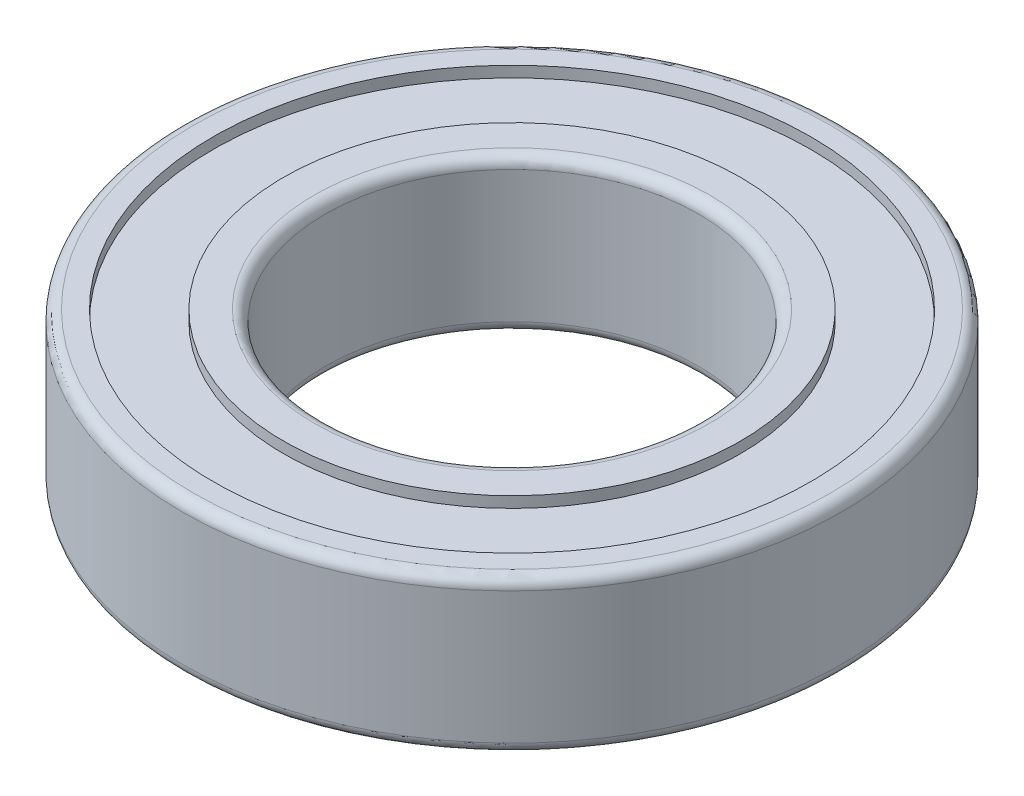
ISO-10303-21;
HEADER;
FILE_DESCRIPTION(('STEP AP214'),'2;1');
FILE_NAME('part.step','',(''),(''),'','','');
FILE_SCHEMA(('AUTOMOTIVE_DESIGN { 1 0 10303 214 1 1 1 1 }'));
ENDSEC;
DATA;
#1=APPLICATION_CONTEXT('core data for automotive mechanical design processes');
#2=APPLICATION_PROTOCOL_DEFINITION('international standard','automotive_design',2000,#1);
#3=PRODUCT_CONTEXT('',#1,'mechanical');
#4=PRODUCT('Part','Part','',(#3));
#5=PRODUCT_RELATED_PRODUCT_CATEGORY('part','',(#4));
#6=PRODUCT_DEFINITION_FORMATION('','',#4);
#7=PRODUCT_DEFINITION_CONTEXT('part definition',#1,'design');
#8=PRODUCT_DEFINITION('design','',#6,#7);
#9=PRODUCT_DEFINITION_SHAPE('','',#8);
#10=(LENGTH_UNIT() NAMED_UNIT(*) SI_UNIT(.MILLI.,.METRE.));
#11=(NAMED_UNIT(*) PLANE_ANGLE_UNIT() SI_UNIT($,.RADIAN.));
#12=(NAMED_UNIT(*) SI_UNIT($,.STERADIAN.) SOLID_ANGLE_UNIT());
#13=UNCERTAINTY_MEASURE_WITH_UNIT(LENGTH_MEASURE(1.E-05),#10,'distance_accuracy_value','');
#14=(GEOMETRIC_REPRESENTATION_CONTEXT(3) GLOBAL_UNCERTAINTY_ASSIGNED_CONTEXT((#13)) GLOBAL_UNIT_ASSIGNED_CONTEXT((#10,
#11,#12)) REPRESENTATION_CONTEXT('',''));
#15=CARTESIAN_POINT('',(0.,0.,0.));
#16=DIRECTION('',(0.,0.,1.));
#17=DIRECTION('',(1.,0.,0.));
#18=AXIS2_PLACEMENT_3D('',#15,#16,#17);
#19=CARTESIAN_POINT('',(0.,0.,0.));
#20=DIRECTION('',(0.,-1.,0.));
#21=DIRECTION('',(0.,0.,-1.));
#22=AXIS2_PLACEMENT_3D('',#19,#20,#21);
#23=CYLINDRICAL_SURFACE('',#22,8.5);
#24=CARTESIAN_POINT('',(0.,0.5,0.));
#25=DIRECTION('',(0.,-1.,0.));
#26=DIRECTION('',(0.,0.,-1.));
#27=AXIS2_PLACEMENT_3D('',#24,#25,#26);
#28=CIRCLE('',#27,8.5);
#29=CARTESIAN_POINT('',(0.,0.5,-8.5));
#30=VERTEX_POINT('',#29);
#31=EDGE_CURVE('E53',#30,#30,#28,.T.);
#32=ORIENTED_EDGE('',*,*,#31,.T.);
#33=EDGE_LOOP('',(#32));
#34=FACE_BOUND('',#33,.T.);
#35=CARTESIAN_POINT('',(0.,6.5,0.));
#36=DIRECTION('',(0.,1.,0.));
#37=DIRECTION('',(0.,0.,1.));
#38=AXIS2_PLACEMENT_3D('',#35,#36,#37);
#39=CIRCLE('',#38,8.5);
#40=CARTESIAN_POINT('',(0.,6.5,8.5));
#41=VERTEX_POINT('',#40);
#42=EDGE_CURVE('E56',#41,#41,#39,.T.);
#43=ORIENTED_EDGE('',*,*,#42,.T.);
#44=EDGE_LOOP('',(#43));
#45=FACE_BOUND('',#44,.T.);
#46=ADVANCED_FACE('F39',(#34,#45),#23,.F.);
#47=CARTESIAN_POINT('',(8.5,0.,0.));
#48=DIRECTION('',(0.,-1.,0.));
#49=DIRECTION('',(0.,0.,-1.));
#50=AXIS2_PLACEMENT_3D('',#47,#48,#49);
#51=PLANE('',#50);
#52=CARTESIAN_POINT('',(0.,0.,0.));
#53=DIRECTION('',(0.,-1.,0.));
#54=DIRECTION('',(0.,0.,-1.));
#55=AXIS2_PLACEMENT_3D('',#52,#53,#54);
#56=CIRCLE('',#55,9.);
#57=CARTESIAN_POINT('',(0.,0.,-9.));
#58=VERTEX_POINT('',#57);
#59=EDGE_CURVE('E49',#58,#58,#56,.F.);
#60=ORIENTED_EDGE('',*,*,#59,.T.);
#61=EDGE_LOOP('',(#60));
#62=FACE_BOUND('',#61,.T.);
#63=CARTESIAN_POINT('',(0.,0.,0.));
#64=DIRECTION('',(0.,-1.,0.));
#65=DIRECTION('',(0.,0.,-1.));
#66=AXIS2_PLACEMENT_3D('',#63,#64,#65);
#67=CIRCLE('',#66,10.4);
#68=CARTESIAN_POINT('',(0.,0.,-10.4));
#69=VERTEX_POINT('',#68);
#70=EDGE_CURVE('E72',#69,#69,#67,.T.);
#71=ORIENTED_EDGE('',*,*,#70,.T.);
#72=EDGE_LOOP('',(#71));
#73=FACE_BOUND('',#72,.T.);
#74=ADVANCED_FACE('F111',(#62,#73),#51,.T.);
#75=CARTESIAN_POINT('',(0.,0.,0.));
#76=DIRECTION('',(0.,-1.,0.));
#77=DIRECTION('',(0.,0.,-1.));
#78=AXIS2_PLACEMENT_3D('',#75,#76,#77);
#79=CYLINDRICAL_SURFACE('',#78,10.4);
#80=CARTESIAN_POINT('',(0.,0.5,0.));
#81=DIRECTION('',(0.,-1.,0.));
#82=DIRECTION('',(0.,0.,-1.));
#83=AXIS2_PLACEMENT_3D('',#80,#81,#82);
#84=CIRCLE('',#83,10.4);
#85=CARTESIAN_POINT('',(0.,0.5,-10.4));
#86=VERTEX_POINT('',#85);
#87=EDGE_CURVE('E74',#86,#86,#84,.T.);
#88=ORIENTED_EDGE('',*,*,#87,.T.);
#89=EDGE_LOOP('',(#88));
#90=FACE_BOUND('',#89,.T.);
#91=ORIENTED_EDGE('',*,*,#70,.F.);
#92=EDGE_LOOP('',(#91));
#93=FACE_BOUND('',#92,.T.);
#94=ADVANCED_FACE('F117',(#90,#93),#79,.T.);
#95=CARTESIAN_POINT('',(10.4,0.5,0.));
#96=DIRECTION('',(0.,-1.,0.));
#97=DIRECTION('',(0.,0.,-1.));
#98=AXIS2_PLACEMENT_3D('',#95,#96,#97);
#99=PLANE('',#98);
#100=CARTESIAN_POINT('',(0.,0.5,0.));
#101=DIRECTION('',(0.,-1.,0.));
#102=DIRECTION('',(0.,0.,-1.));
#103=AXIS2_PLACEMENT_3D('',#100,#101,#102);
#104=CIRCLE('',#103,13.6);
#105=CARTESIAN_POINT('',(0.,0.5,-13.6));
#106=VERTEX_POINT('',#105);
#107=EDGE_CURVE('E80',#106,#106,#104,.T.);
#108=ORIENTED_EDGE('',*,*,#107,.T.);
#109=EDGE_LOOP('',(#108));
#110=FACE_BOUND('',#109,.T.);
#111=ORIENTED_EDGE('',*,*,#87,.F.);
#112=EDGE_LOOP('',(#111));
#113=FACE_BOUND('',#112,.T.);
#114=ADVANCED_FACE('F156',(#110,#113),#99,.T.);
#115=CARTESIAN_POINT('',(0.,0.,0.));
#116=DIRECTION('',(0.,-1.,0.));
#117=DIRECTION('',(0.,0.,-1.));
#118=AXIS2_PLACEMENT_3D('',#115,#116,#117);
#119=CYLINDRICAL_SURFACE('',#118,13.6);
#120=CARTESIAN_POINT('',(0.,0.,0.));
#121=DIRECTION('',(0.,-1.,0.));
#122=DIRECTION('',(0.,0.,-1.));
#123=AXIS2_PLACEMENT_3D('',#120,#121,#122);
#124=CIRCLE('',#123,13.6);
#125=CARTESIAN_POINT('',(0.,0.,-13.6));
#126=VERTEX_POINT('',#125);
#127=EDGE_CURVE('E77',#126,#126,#124,.T.);
#128=ORIENTED_EDGE('',*,*,#127,.T.);
#129=EDGE_LOOP('',(#128));
#130=FACE_BOUND('',#129,.T.);
#131=ORIENTED_EDGE('',*,*,#107,.F.);
#132=EDGE_LOOP('',(#131));
#133=FACE_BOUND('',#132,.T.);
#134=ADVANCED_FACE('F149',(#130,#133),#119,.F.);
#135=CARTESIAN_POINT('',(13.6,0.,0.));
#136=DIRECTION('',(0.,-1.,0.));
#137=DIRECTION('',(0.,0.,-1.));
#138=AXIS2_PLACEMENT_3D('',#135,#136,#137);
#139=PLANE('',#138);
#140=CARTESIAN_POINT('',(0.,0.,0.));
#141=DIRECTION('',(0.,-1.,0.));
#142=DIRECTION('',(0.,0.,-1.));
#143=AXIS2_PLACEMENT_3D('',#140,#141,#142);
#144=CIRCLE('',#143,14.5);
#145=CARTESIAN_POINT('',(0.,0.,-14.5));
#146=VERTEX_POINT('',#145);
#147=EDGE_CURVE('E67',#146,#146,#144,.T.);
#148=ORIENTED_EDGE('',*,*,#147,.T.);
#149=EDGE_LOOP('',(#148));
#150=FACE_BOUND('',#149,.T.);
#151=ORIENTED_EDGE('',*,*,#127,.F.);
#152=EDGE_LOOP('',(#151));
#153=FACE_BOUND('',#152,.T.);
#154=ADVANCED_FACE('F143',(#150,#153),#139,.T.);
#155=CARTESIAN_POINT('',(0.,0.,0.));
#156=DIRECTION('',(0.,-1.,0.));
#157=DIRECTION('',(0.,0.,-1.));
#158=AXIS2_PLACEMENT_3D('',#155,#156,#157);
#159=CYLINDRICAL_SURFACE('',#158,15.);
#160=CARTESIAN_POINT('',(0.,0.5,0.));
#161=DIRECTION('',(0.,-1.,0.));
#162=DIRECTION('',(0.,0.,-1.));
#163=AXIS2_PLACEMENT_3D('',#160,#161,#162);
#164=CIRCLE('',#163,15.);
#165=CARTESIAN_POINT('',(0.,0.5,-15.));
#166=VERTEX_POINT('',#165);
#167=EDGE_CURVE('E65',#166,#166,#164,.F.);
#168=ORIENTED_EDGE('',*,*,#167,.T.);
#169=EDGE_LOOP('',(#168));
#170=FACE_BOUND('',#169,.T.);
#171=CARTESIAN_POINT('',(0.,6.5,0.));
#172=DIRECTION('',(0.,1.,0.));
#173=DIRECTION('',(0.,0.,1.));
#174=AXIS2_PLACEMENT_3D('',#171,#172,#173);
#175=CIRCLE('',#174,15.);
#176=CARTESIAN_POINT('',(0.,6.5,15.));
#177=VERTEX_POINT('',#176);
#178=EDGE_CURVE('E62',#177,#177,#175,.F.);
#179=ORIENTED_EDGE('',*,*,#178,.T.);
#180=EDGE_LOOP('',(#179));
#181=FACE_BOUND('',#180,.T.);
#182=ADVANCED_FACE('F137',(#170,#181),#159,.T.);
#183=CARTESIAN_POINT('',(15.,7.,0.));
#184=DIRECTION('',(0.,1.,0.));
#185=DIRECTION('',(0.,0.,1.));
#186=AXIS2_PLACEMENT_3D('',#183,#184,#185);
#187=PLANE('',#186);
#188=CARTESIAN_POINT('',(0.,7.,0.));
#189=DIRECTION('',(0.,1.,0.));
#190=DIRECTION('',(0.,0.,1.));
#191=AXIS2_PLACEMENT_3D('',#188,#189,#190);
#192=CIRCLE('',#191,14.5);
#193=CARTESIAN_POINT('',(0.,7.,14.5));
#194=VERTEX_POINT('',#193);
#195=EDGE_CURVE('E46',#194,#194,#192,.T.);
#196=ORIENTED_EDGE('',*,*,#195,.T.);
#197=EDGE_LOOP('',(#196));
#198=FACE_BOUND('',#197,.T.);
#199=CARTESIAN_POINT('',(0.,7.,0.));
#200=DIRECTION('',(0.,-1.,0.));
#201=DIRECTION('',(0.,0.,-1.));
#202=AXIS2_PLACEMENT_3D('',#199,#200,#201);
#203=CIRCLE('',#202,13.6);
#204=CARTESIAN_POINT('',(0.,7.,-13.6));
#205=VERTEX_POINT('',#204);
#206=EDGE_CURVE('E82',#205,#205,#203,.T.);
#207=ORIENTED_EDGE('',*,*,#206,.T.);
#208=EDGE_LOOP('',(#207));
#209=FACE_BOUND('',#208,.T.);
#210=ADVANCED_FACE('F139',(#198,#209),#187,.T.);
#211=CARTESIAN_POINT('',(0.,0.,0.));
#212=DIRECTION('',(0.,-1.,0.));
#213=DIRECTION('',(0.,0.,-1.));
#214=AXIS2_PLACEMENT_3D('',#211,#212,#213);
#215=CYLINDRICAL_SURFACE('',#214,13.6);
#216=CARTESIAN_POINT('',(0.,6.5,0.));
#217=DIRECTION('',(0.,-1.,0.));
#218=DIRECTION('',(0.,0.,-1.));
#219=AXIS2_PLACEMENT_3D('',#216,#217,#218);
#220=CIRCLE('',#219,13.6);
#221=CARTESIAN_POINT('',(0.,6.5,-13.6));
#222=VERTEX_POINT('',#221);
#223=EDGE_CURVE('E88',#222,#222,#220,.T.);
#224=ORIENTED_EDGE('',*,*,#223,.T.);
#225=EDGE_LOOP('',(#224));
#226=FACE_BOUND('',#225,.T.);
#227=ORIENTED_EDGE('',*,*,#206,.F.);
#228=EDGE_LOOP('',(#227));
#229=FACE_BOUND('',#228,.T.);
#230=ADVANCED_FACE('F150',(#226,#229),#215,.F.);
#231=CARTESIAN_POINT('',(13.6,6.5,0.));
#232=DIRECTION('',(0.,1.,0.));
#233=DIRECTION('',(0.,0.,1.));
#234=AXIS2_PLACEMENT_3D('',#231,#232,#233);
#235=PLANE('',#234);
#236=CARTESIAN_POINT('',(0.,6.5,0.));
#237=DIRECTION('',(0.,-1.,0.));
#238=DIRECTION('',(0.,0.,-1.));
#239=AXIS2_PLACEMENT_3D('',#236,#237,#238);
#240=CIRCLE('',#239,10.4);
#241=CARTESIAN_POINT('',(0.,6.5,-10.4));
#242=VERTEX_POINT('',#241);
#243=EDGE_CURVE('E90',#242,#242,#240,.T.);
#244=ORIENTED_EDGE('',*,*,#243,.T.);
#245=EDGE_LOOP('',(#244));
#246=FACE_BOUND('',#245,.T.);
#247=ORIENTED_EDGE('',*,*,#223,.F.);
#248=EDGE_LOOP('',(#247));
#249=FACE_BOUND('',#248,.T.);
#250=ADVANCED_FACE('F112',(#246,#249),#235,.T.);
#251=CARTESIAN_POINT('',(0.,0.,0.));
#252=DIRECTION('',(0.,-1.,0.));
#253=DIRECTION('',(0.,0.,-1.));
#254=AXIS2_PLACEMENT_3D('',#251,#252,#253);
#255=CYLINDRICAL_SURFACE('',#254,10.4);
#256=CARTESIAN_POINT('',(0.,7.,0.));
#257=DIRECTION('',(0.,-1.,0.));
#258=DIRECTION('',(0.,0.,-1.));
#259=AXIS2_PLACEMENT_3D('',#256,#257,#258);
#260=CIRCLE('',#259,10.4);
#261=CARTESIAN_POINT('',(0.,7.,-10.4));
#262=VERTEX_POINT('',#261);
#263=EDGE_CURVE('E95',#262,#262,#260,.T.);
#264=ORIENTED_EDGE('',*,*,#263,.T.);
#265=EDGE_LOOP('',(#264));
#266=FACE_BOUND('',#265,.T.);
#267=ORIENTED_EDGE('',*,*,#243,.F.);
#268=EDGE_LOOP('',(#267));
#269=FACE_BOUND('',#268,.T.);
#270=ADVANCED_FACE('F96',(#266,#269),#255,.T.);
#271=CARTESIAN_POINT('',(10.4,7.,0.));
#272=DIRECTION('',(0.,1.,0.));
#273=DIRECTION('',(0.,0.,1.));
#274=AXIS2_PLACEMENT_3D('',#271,#272,#273);
#275=PLANE('',#274);
#276=CARTESIAN_POINT('',(0.,7.,0.));
#277=DIRECTION('',(0.,1.,0.));
#278=DIRECTION('',(0.,0.,1.));
#279=AXIS2_PLACEMENT_3D('',#276,#277,#278);
#280=CIRCLE('',#279,9.);
#281=CARTESIAN_POINT('',(0.,7.,9.));
#282=VERTEX_POINT('',#281);
#283=EDGE_CURVE('E10',#282,#282,#280,.F.);
#284=ORIENTED_EDGE('',*,*,#283,.T.);
#285=EDGE_LOOP('',(#284));
#286=FACE_BOUND('',#285,.T.);
#287=ORIENTED_EDGE('',*,*,#263,.F.);
#288=EDGE_LOOP('',(#287));
#289=FACE_BOUND('',#288,.T.);
#290=ADVANCED_FACE('F97',(#286,#289),#275,.T.);
#291=CARTESIAN_POINT('',(0.,0.5,0.));
#292=DIRECTION('',(0.,-1.,0.));
#293=DIRECTION('',(0.,0.,-1.));
#294=AXIS2_PLACEMENT_3D('',#291,#292,#293);
#295=TOROIDAL_SURFACE('',#294,14.5,0.5);
#296=ORIENTED_EDGE('',*,*,#167,.F.);
#297=EDGE_LOOP('',(#296));
#298=FACE_BOUND('',#297,.T.);
#299=ORIENTED_EDGE('',*,*,#147,.F.);
#300=EDGE_LOOP('',(#299));
#301=FACE_BOUND('',#300,.T.);
#302=ADVANCED_FACE('F101',(#298,#301),#295,.T.);
#303=CARTESIAN_POINT('',(0.,0.5,0.));
#304=DIRECTION('',(0.,-1.,0.));
#305=DIRECTION('',(0.,0.,-1.));
#306=AXIS2_PLACEMENT_3D('',#303,#304,#305);
#307=TOROIDAL_SURFACE('',#306,9.,0.5);
#308=ORIENTED_EDGE('',*,*,#59,.F.);
#309=EDGE_LOOP('',(#308));
#310=FACE_BOUND('',#309,.T.);
#311=ORIENTED_EDGE('',*,*,#31,.F.);
#312=EDGE_LOOP('',(#311));
#313=FACE_BOUND('',#312,.T.);
#314=ADVANCED_FACE('F110',(#310,#313),#307,.T.);
#315=CARTESIAN_POINT('',(0.,6.5,0.));
#316=DIRECTION('',(0.,1.,0.));
#317=DIRECTION('',(0.,0.,1.));
#318=AXIS2_PLACEMENT_3D('',#315,#316,#317);
#319=TOROIDAL_SURFACE('',#318,14.5,0.5);
#320=ORIENTED_EDGE('',*,*,#195,.F.);
#321=EDGE_LOOP('',(#320));
#322=FACE_BOUND('',#321,.T.);
#323=ORIENTED_EDGE('',*,*,#178,.F.);
#324=EDGE_LOOP('',(#323));
#325=FACE_BOUND('',#324,.T.);
#326=ADVANCED_FACE('F130',(#322,#325),#319,.T.);
#327=CARTESIAN_POINT('',(0.,6.5,0.));
#328=DIRECTION('',(0.,1.,0.));
#329=DIRECTION('',(0.,0.,1.));
#330=AXIS2_PLACEMENT_3D('',#327,#328,#329);
#331=TOROIDAL_SURFACE('',#330,9.,0.5);
#332=ORIENTED_EDGE('',*,*,#42,.F.);
#333=EDGE_LOOP('',(#332));
#334=FACE_BOUND('',#333,.T.);
#335=ORIENTED_EDGE('',*,*,#283,.F.);
#336=EDGE_LOOP('',(#335));
#337=FACE_BOUND('',#336,.T.);
#338=ADVANCED_FACE('F41',(#334,#337),#331,.T.);
#339=CLOSED_SHELL('',(#46,#74,#94,#114,#134,#154,#182,#210,#230,#250,#270,#290,#302,#314,#326,#338));
#340=MANIFOLD_SOLID_BREP('B2',#339);
#341=ADVANCED_BREP_SHAPE_REPRESENTATION('',(#18,#340),#14);
#342=SHAPE_DEFINITION_REPRESENTATION(#9,#341);
ENDSEC;
END-ISO-10303-21;
